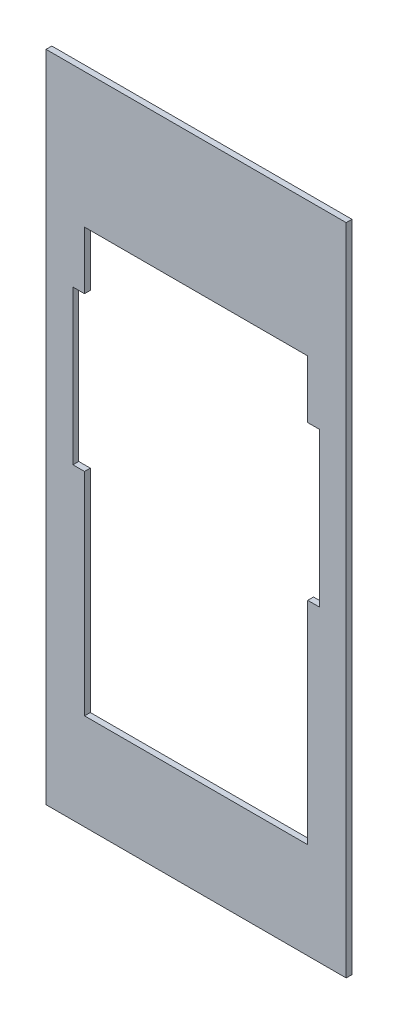
ISO-10303-21;
HEADER;
FILE_DESCRIPTION(('STEP AP214'),'2;1');
FILE_NAME('part.step','',(''),(''),'','','');
FILE_SCHEMA(('AUTOMOTIVE_DESIGN { 1 0 10303 214 1 1 1 1 }'));
ENDSEC;
DATA;
#1=APPLICATION_CONTEXT('core data for automotive mechanical design processes');
#2=APPLICATION_PROTOCOL_DEFINITION('international standard','automotive_design',2000,#1);
#3=PRODUCT_CONTEXT('',#1,'mechanical');
#4=PRODUCT('Part','Part','',(#3));
#5=PRODUCT_RELATED_PRODUCT_CATEGORY('part','',(#4));
#6=PRODUCT_DEFINITION_FORMATION('','',#4);
#7=PRODUCT_DEFINITION_CONTEXT('part definition',#1,'design');
#8=PRODUCT_DEFINITION('design','',#6,#7);
#9=PRODUCT_DEFINITION_SHAPE('','',#8);
#10=(LENGTH_UNIT() NAMED_UNIT(*) SI_UNIT(.MILLI.,.METRE.));
#11=(NAMED_UNIT(*) PLANE_ANGLE_UNIT() SI_UNIT($,.RADIAN.));
#12=(NAMED_UNIT(*) SI_UNIT($,.STERADIAN.) SOLID_ANGLE_UNIT());
#13=UNCERTAINTY_MEASURE_WITH_UNIT(LENGTH_MEASURE(1.E-05),#10,'distance_accuracy_value','');
#14=(GEOMETRIC_REPRESENTATION_CONTEXT(3) GLOBAL_UNCERTAINTY_ASSIGNED_CONTEXT((#13)) GLOBAL_UNIT_ASSIGNED_CONTEXT((#10,
#11,#12)) REPRESENTATION_CONTEXT('',''));
#15=CARTESIAN_POINT('',(0.,0.,0.));
#16=DIRECTION('',(0.,0.,1.));
#17=DIRECTION('',(1.,0.,0.));
#18=AXIS2_PLACEMENT_3D('',#15,#16,#17);
#19=CARTESIAN_POINT('',(0.,0.,1.5));
#20=DIRECTION('',(0.,0.,-1.));
#21=DIRECTION('',(-1.,0.,0.));
#22=AXIS2_PLACEMENT_3D('',#19,#20,#21);
#23=PLANE('',#22);
#24=DIRECTION('',(0.,-1.,0.));
#25=VECTOR('',#24,1.);
#26=CARTESIAN_POINT('',(-39.,84.9999999999999,1.5));
#27=LINE('',#26,#25);
#28=CARTESIAN_POINT('',(-39.,84.9999999999999,1.5));
#29=VERTEX_POINT('',#28);
#30=CARTESIAN_POINT('',(-39.,-85.0000000000001,1.5));
#31=VERTEX_POINT('',#30);
#32=EDGE_CURVE('E239',#29,#31,#27,.T.);
#33=ORIENTED_EDGE('',*,*,#32,.T.);
#34=DIRECTION('',(1.,0.,0.));
#35=VECTOR('',#34,1.);
#36=CARTESIAN_POINT('',(39.,-85.0000000000001,1.5));
#37=LINE('',#36,#35);
#38=CARTESIAN_POINT('',(39.,-85.0000000000001,1.5));
#39=VERTEX_POINT('',#38);
#40=EDGE_CURVE('E242',#31,#39,#37,.T.);
#41=ORIENTED_EDGE('',*,*,#40,.T.);
#42=DIRECTION('',(0.,1.,0.));
#43=VECTOR('',#42,1.);
#44=CARTESIAN_POINT('',(39.,85.,1.5));
#45=LINE('',#44,#43);
#46=CARTESIAN_POINT('',(39.,85.,1.5));
#47=VERTEX_POINT('',#46);
#48=EDGE_CURVE('E245',#39,#47,#45,.T.);
#49=ORIENTED_EDGE('',*,*,#48,.T.);
#50=DIRECTION('',(-1.,0.,0.));
#51=VECTOR('',#50,1.);
#52=CARTESIAN_POINT('',(39.,85.,1.5));
#53=LINE('',#52,#51);
#54=EDGE_CURVE('E247',#47,#29,#53,.T.);
#55=ORIENTED_EDGE('',*,*,#54,.T.);
#56=EDGE_LOOP('',(#33,#41,#49,#55));
#57=FACE_BOUND('',#56,.T.);
#58=DIRECTION('',(0.,-1.,0.));
#59=VECTOR('',#58,1.);
#60=CARTESIAN_POINT('',(-29.,-5.00000000000007,1.5));
#61=LINE('',#60,#59);
#62=CARTESIAN_POINT('',(-29.,-5.00000000000007,1.5));
#63=VERTEX_POINT('',#62);
#64=CARTESIAN_POINT('',(-29.,-60.0000000000001,1.5));
#65=VERTEX_POINT('',#64);
#66=EDGE_CURVE('E146',#63,#65,#61,.T.);
#67=ORIENTED_EDGE('',*,*,#66,.F.);
#68=DIRECTION('',(1.,0.,0.));
#69=VECTOR('',#68,1.);
#70=CARTESIAN_POINT('',(-29.,-5.00000000000007,1.5));
#71=LINE('',#70,#69);
#72=CARTESIAN_POINT('',(-32.,-5.00000000000007,1.5));
#73=VERTEX_POINT('',#72);
#74=EDGE_CURVE('E187',#73,#63,#71,.T.);
#75=ORIENTED_EDGE('',*,*,#74,.F.);
#76=DIRECTION('',(0.,-1.,0.));
#77=VECTOR('',#76,1.);
#78=CARTESIAN_POINT('',(-32.,34.9999999999999,1.5));
#79=LINE('',#78,#77);
#80=CARTESIAN_POINT('',(-32.,34.9999999999999,1.5));
#81=VERTEX_POINT('',#80);
#82=EDGE_CURVE('E185',#81,#73,#79,.T.);
#83=ORIENTED_EDGE('',*,*,#82,.F.);
#84=DIRECTION('',(-1.,0.,0.));
#85=VECTOR('',#84,1.);
#86=CARTESIAN_POINT('',(-29.,34.9999999999999,1.5));
#87=LINE('',#86,#85);
#88=CARTESIAN_POINT('',(-29.,34.9999999999999,1.5));
#89=VERTEX_POINT('',#88);
#90=EDGE_CURVE('E183',#89,#81,#87,.T.);
#91=ORIENTED_EDGE('',*,*,#90,.F.);
#92=DIRECTION('',(0.,-1.,0.));
#93=VECTOR('',#92,1.);
#94=CARTESIAN_POINT('',(-29.,49.9999999999999,1.5));
#95=LINE('',#94,#93);
#96=CARTESIAN_POINT('',(-29.,49.9999999999999,1.5));
#97=VERTEX_POINT('',#96);
#98=EDGE_CURVE('E181',#97,#89,#95,.T.);
#99=ORIENTED_EDGE('',*,*,#98,.F.);
#100=DIRECTION('',(-1.,0.,0.));
#101=VECTOR('',#100,1.);
#102=CARTESIAN_POINT('',(29.,49.9999999999999,1.5));
#103=LINE('',#102,#101);
#104=CARTESIAN_POINT('',(29.,49.9999999999999,1.5));
#105=VERTEX_POINT('',#104);
#106=EDGE_CURVE('E179',#105,#97,#103,.T.);
#107=ORIENTED_EDGE('',*,*,#106,.F.);
#108=DIRECTION('',(0.,1.,0.));
#109=VECTOR('',#108,1.);
#110=CARTESIAN_POINT('',(29.,49.9999999999999,1.5));
#111=LINE('',#110,#109);
#112=CARTESIAN_POINT('',(29.,34.9999999999999,1.5));
#113=VERTEX_POINT('',#112);
#114=EDGE_CURVE('E177',#113,#105,#111,.T.);
#115=ORIENTED_EDGE('',*,*,#114,.F.);
#116=DIRECTION('',(-1.,0.,0.));
#117=VECTOR('',#116,1.);
#118=CARTESIAN_POINT('',(29.,34.9999999999999,1.5));
#119=LINE('',#118,#117);
#120=CARTESIAN_POINT('',(32.,34.9999999999999,1.5));
#121=VERTEX_POINT('',#120);
#122=EDGE_CURVE('E175',#121,#113,#119,.T.);
#123=ORIENTED_EDGE('',*,*,#122,.F.);
#124=DIRECTION('',(0.,1.,0.));
#125=VECTOR('',#124,1.);
#126=CARTESIAN_POINT('',(32.,34.9999999999999,1.5));
#127=LINE('',#126,#125);
#128=CARTESIAN_POINT('',(32.,-5.00000000000007,1.5));
#129=VERTEX_POINT('',#128);
#130=EDGE_CURVE('E173',#129,#121,#127,.T.);
#131=ORIENTED_EDGE('',*,*,#130,.F.);
#132=DIRECTION('',(1.,0.,0.));
#133=VECTOR('',#132,1.);
#134=CARTESIAN_POINT('',(29.,-5.00000000000007,1.5));
#135=LINE('',#134,#133);
#136=CARTESIAN_POINT('',(29.,-5.00000000000007,1.5));
#137=VERTEX_POINT('',#136);
#138=EDGE_CURVE('E169',#137,#129,#135,.T.);
#139=ORIENTED_EDGE('',*,*,#138,.F.);
#140=DIRECTION('',(0.,1.,0.));
#141=VECTOR('',#140,1.);
#142=CARTESIAN_POINT('',(29.,-5.00000000000007,1.5));
#143=LINE('',#142,#141);
#144=CARTESIAN_POINT('',(29.,-60.0000000000001,1.5));
#145=VERTEX_POINT('',#144);
#146=EDGE_CURVE('E167',#145,#137,#143,.T.);
#147=ORIENTED_EDGE('',*,*,#146,.F.);
#148=DIRECTION('',(1.,0.,0.));
#149=VECTOR('',#148,1.);
#150=CARTESIAN_POINT('',(-29.,-60.0000000000001,1.5));
#151=LINE('',#150,#149);
#152=EDGE_CURVE('E154',#65,#145,#151,.T.);
#153=ORIENTED_EDGE('',*,*,#152,.F.);
#154=EDGE_LOOP('',(#67,#75,#83,#91,#99,#107,#115,#123,#131,#139,#147,#153));
#155=FACE_BOUND('',#154,.T.);
#156=ADVANCED_FACE('F33',(#57,#155),#23,.F.);
#157=CARTESIAN_POINT('',(0.,0.,0.));
#158=DIRECTION('',(0.,0.,-1.));
#159=DIRECTION('',(-1.,0.,0.));
#160=AXIS2_PLACEMENT_3D('',#157,#158,#159);
#161=PLANE('',#160);
#162=DIRECTION('',(0.,-1.,0.));
#163=VECTOR('',#162,1.);
#164=CARTESIAN_POINT('',(-39.,84.9999999999999,0.));
#165=LINE('',#164,#163);
#166=CARTESIAN_POINT('',(-39.,84.9999999999999,0.));
#167=VERTEX_POINT('',#166);
#168=CARTESIAN_POINT('',(-39.,-85.0000000000001,0.));
#169=VERTEX_POINT('',#168);
#170=EDGE_CURVE('E162',#167,#169,#165,.T.);
#171=ORIENTED_EDGE('',*,*,#170,.F.);
#172=DIRECTION('',(-1.,0.,0.));
#173=VECTOR('',#172,1.);
#174=CARTESIAN_POINT('',(39.,85.,0.));
#175=LINE('',#174,#173);
#176=CARTESIAN_POINT('',(39.,85.,0.));
#177=VERTEX_POINT('',#176);
#178=EDGE_CURVE('E243',#177,#167,#175,.T.);
#179=ORIENTED_EDGE('',*,*,#178,.F.);
#180=DIRECTION('',(0.,1.,0.));
#181=VECTOR('',#180,1.);
#182=CARTESIAN_POINT('',(39.,85.,0.));
#183=LINE('',#182,#181);
#184=CARTESIAN_POINT('',(39.,-85.0000000000001,0.));
#185=VERTEX_POINT('',#184);
#186=EDGE_CURVE('E254',#185,#177,#183,.T.);
#187=ORIENTED_EDGE('',*,*,#186,.F.);
#188=DIRECTION('',(1.,0.,0.));
#189=VECTOR('',#188,1.);
#190=CARTESIAN_POINT('',(39.,-85.0000000000001,0.));
#191=LINE('',#190,#189);
#192=EDGE_CURVE('E252',#169,#185,#191,.T.);
#193=ORIENTED_EDGE('',*,*,#192,.F.);
#194=EDGE_LOOP('',(#171,#179,#187,#193));
#195=FACE_BOUND('',#194,.T.);
#196=DIRECTION('',(1.,0.,0.));
#197=VECTOR('',#196,1.);
#198=CARTESIAN_POINT('',(-29.,-5.00000000000007,0.));
#199=LINE('',#198,#197);
#200=CARTESIAN_POINT('',(-32.,-5.00000000000007,0.));
#201=VERTEX_POINT('',#200);
#202=CARTESIAN_POINT('',(-29.,-5.00000000000007,0.));
#203=VERTEX_POINT('',#202);
#204=EDGE_CURVE('E155',#201,#203,#199,.T.);
#205=ORIENTED_EDGE('',*,*,#204,.T.);
#206=DIRECTION('',(0.,-1.,0.));
#207=VECTOR('',#206,1.);
#208=CARTESIAN_POINT('',(-29.,-5.00000000000007,0.));
#209=LINE('',#208,#207);
#210=CARTESIAN_POINT('',(-29.,-60.0000000000001,0.));
#211=VERTEX_POINT('',#210);
#212=EDGE_CURVE('E56',#203,#211,#209,.T.);
#213=ORIENTED_EDGE('',*,*,#212,.T.);
#214=DIRECTION('',(1.,0.,0.));
#215=VECTOR('',#214,1.);
#216=CARTESIAN_POINT('',(-29.,-60.0000000000001,0.));
#217=LINE('',#216,#215);
#218=CARTESIAN_POINT('',(29.,-60.0000000000001,0.));
#219=VERTEX_POINT('',#218);
#220=EDGE_CURVE('E161',#211,#219,#217,.T.);
#221=ORIENTED_EDGE('',*,*,#220,.T.);
#222=DIRECTION('',(0.,1.,0.));
#223=VECTOR('',#222,1.);
#224=CARTESIAN_POINT('',(29.,-5.00000000000007,0.));
#225=LINE('',#224,#223);
#226=CARTESIAN_POINT('',(29.,-5.00000000000007,0.));
#227=VERTEX_POINT('',#226);
#228=EDGE_CURVE('E191',#219,#227,#225,.T.);
#229=ORIENTED_EDGE('',*,*,#228,.T.);
#230=DIRECTION('',(1.,0.,0.));
#231=VECTOR('',#230,1.);
#232=CARTESIAN_POINT('',(29.,-5.00000000000007,0.));
#233=LINE('',#232,#231);
#234=CARTESIAN_POINT('',(32.,-5.00000000000007,0.));
#235=VERTEX_POINT('',#234);
#236=EDGE_CURVE('E194',#227,#235,#233,.T.);
#237=ORIENTED_EDGE('',*,*,#236,.T.);
#238=DIRECTION('',(0.,1.,0.));
#239=VECTOR('',#238,1.);
#240=CARTESIAN_POINT('',(32.,34.9999999999999,0.));
#241=LINE('',#240,#239);
#242=CARTESIAN_POINT('',(32.,34.9999999999999,0.));
#243=VERTEX_POINT('',#242);
#244=EDGE_CURVE('E197',#235,#243,#241,.T.);
#245=ORIENTED_EDGE('',*,*,#244,.T.);
#246=DIRECTION('',(-1.,0.,0.));
#247=VECTOR('',#246,1.);
#248=CARTESIAN_POINT('',(29.,34.9999999999999,0.));
#249=LINE('',#248,#247);
#250=CARTESIAN_POINT('',(29.,34.9999999999999,0.));
#251=VERTEX_POINT('',#250);
#252=EDGE_CURVE('E200',#243,#251,#249,.T.);
#253=ORIENTED_EDGE('',*,*,#252,.T.);
#254=DIRECTION('',(0.,1.,0.));
#255=VECTOR('',#254,1.);
#256=CARTESIAN_POINT('',(29.,49.9999999999999,0.));
#257=LINE('',#256,#255);
#258=CARTESIAN_POINT('',(29.,49.9999999999999,0.));
#259=VERTEX_POINT('',#258);
#260=EDGE_CURVE('E203',#251,#259,#257,.T.);
#261=ORIENTED_EDGE('',*,*,#260,.T.);
#262=DIRECTION('',(-1.,0.,0.));
#263=VECTOR('',#262,1.);
#264=CARTESIAN_POINT('',(29.,49.9999999999999,0.));
#265=LINE('',#264,#263);
#266=CARTESIAN_POINT('',(-29.,49.9999999999999,0.));
#267=VERTEX_POINT('',#266);
#268=EDGE_CURVE('E206',#259,#267,#265,.T.);
#269=ORIENTED_EDGE('',*,*,#268,.T.);
#270=DIRECTION('',(0.,-1.,0.));
#271=VECTOR('',#270,1.);
#272=CARTESIAN_POINT('',(-29.,49.9999999999999,0.));
#273=LINE('',#272,#271);
#274=CARTESIAN_POINT('',(-29.,34.9999999999999,0.));
#275=VERTEX_POINT('',#274);
#276=EDGE_CURVE('E209',#267,#275,#273,.T.);
#277=ORIENTED_EDGE('',*,*,#276,.T.);
#278=DIRECTION('',(-1.,0.,0.));
#279=VECTOR('',#278,1.);
#280=CARTESIAN_POINT('',(-29.,34.9999999999999,0.));
#281=LINE('',#280,#279);
#282=CARTESIAN_POINT('',(-32.,34.9999999999999,0.));
#283=VERTEX_POINT('',#282);
#284=EDGE_CURVE('E212',#275,#283,#281,.T.);
#285=ORIENTED_EDGE('',*,*,#284,.T.);
#286=DIRECTION('',(0.,-1.,0.));
#287=VECTOR('',#286,1.);
#288=CARTESIAN_POINT('',(-32.,34.9999999999999,0.));
#289=LINE('',#288,#287);
#290=EDGE_CURVE('E215',#283,#201,#289,.T.);
#291=ORIENTED_EDGE('',*,*,#290,.T.);
#292=EDGE_LOOP('',(#205,#213,#221,#229,#237,#245,#253,#261,#269,#277,#285,#291));
#293=FACE_BOUND('',#292,.T.);
#294=ADVANCED_FACE('F272',(#195,#293),#161,.T.);
#295=CARTESIAN_POINT('',(-39.,84.9999999999999,1.5));
#296=DIRECTION('',(1.,0.,0.));
#297=DIRECTION('',(0.,1.,0.));
#298=AXIS2_PLACEMENT_3D('',#295,#296,#297);
#299=PLANE('',#298);
#300=ORIENTED_EDGE('',*,*,#170,.T.);
#301=DIRECTION('',(0.,0.,-1.));
#302=VECTOR('',#301,1.);
#303=CARTESIAN_POINT('',(-39.,-85.0000000000001,1.5));
#304=LINE('',#303,#302);
#305=EDGE_CURVE('E11',#31,#169,#304,.T.);
#306=ORIENTED_EDGE('',*,*,#305,.F.);
#307=ORIENTED_EDGE('',*,*,#32,.F.);
#308=DIRECTION('',(0.,0.,-1.));
#309=VECTOR('',#308,1.);
#310=CARTESIAN_POINT('',(-39.,84.9999999999999,1.5));
#311=LINE('',#310,#309);
#312=EDGE_CURVE('E249',#29,#167,#311,.T.);
#313=ORIENTED_EDGE('',*,*,#312,.T.);
#314=EDGE_LOOP('',(#300,#306,#307,#313));
#315=FACE_BOUND('',#314,.T.);
#316=ADVANCED_FACE('F35',(#315),#299,.F.);
#317=CARTESIAN_POINT('',(39.,-85.0000000000001,1.5));
#318=DIRECTION('',(0.,1.,0.));
#319=DIRECTION('',(-1.,0.,0.));
#320=AXIS2_PLACEMENT_3D('',#317,#318,#319);
#321=PLANE('',#320);
#322=ORIENTED_EDGE('',*,*,#192,.T.);
#323=DIRECTION('',(0.,0.,-1.));
#324=VECTOR('',#323,1.);
#325=CARTESIAN_POINT('',(39.,-85.0000000000001,1.5));
#326=LINE('',#325,#324);
#327=EDGE_CURVE('E41',#39,#185,#326,.T.);
#328=ORIENTED_EDGE('',*,*,#327,.F.);
#329=ORIENTED_EDGE('',*,*,#40,.F.);
#330=ORIENTED_EDGE('',*,*,#305,.T.);
#331=EDGE_LOOP('',(#322,#328,#329,#330));
#332=FACE_BOUND('',#331,.T.);
#333=ADVANCED_FACE('F282',(#332),#321,.F.);
#334=CARTESIAN_POINT('',(39.,85.,1.5));
#335=DIRECTION('',(-1.,0.,0.));
#336=DIRECTION('',(0.,-1.,0.));
#337=AXIS2_PLACEMENT_3D('',#334,#335,#336);
#338=PLANE('',#337);
#339=ORIENTED_EDGE('',*,*,#186,.T.);
#340=DIRECTION('',(0.,0.,-1.));
#341=VECTOR('',#340,1.);
#342=CARTESIAN_POINT('',(39.,85.,1.5));
#343=LINE('',#342,#341);
#344=EDGE_CURVE('E259',#47,#177,#343,.T.);
#345=ORIENTED_EDGE('',*,*,#344,.F.);
#346=ORIENTED_EDGE('',*,*,#48,.F.);
#347=ORIENTED_EDGE('',*,*,#327,.T.);
#348=EDGE_LOOP('',(#339,#345,#346,#347));
#349=FACE_BOUND('',#348,.T.);
#350=ADVANCED_FACE('F266',(#349),#338,.F.);
#351=CARTESIAN_POINT('',(39.,85.,1.5));
#352=DIRECTION('',(0.,-1.,0.));
#353=DIRECTION('',(1.,0.,0.));
#354=AXIS2_PLACEMENT_3D('',#351,#352,#353);
#355=PLANE('',#354);
#356=ORIENTED_EDGE('',*,*,#178,.T.);
#357=ORIENTED_EDGE('',*,*,#312,.F.);
#358=ORIENTED_EDGE('',*,*,#54,.F.);
#359=ORIENTED_EDGE('',*,*,#344,.T.);
#360=EDGE_LOOP('',(#356,#357,#358,#359));
#361=FACE_BOUND('',#360,.T.);
#362=ADVANCED_FACE('F276',(#361),#355,.F.);
#363=CARTESIAN_POINT('',(-29.,-5.00000000000007,1.5));
#364=DIRECTION('',(1.,0.,0.));
#365=DIRECTION('',(0.,1.,0.));
#366=AXIS2_PLACEMENT_3D('',#363,#364,#365);
#367=PLANE('',#366);
#368=ORIENTED_EDGE('',*,*,#212,.F.);
#369=DIRECTION('',(0.,0.,-1.));
#370=VECTOR('',#369,1.);
#371=CARTESIAN_POINT('',(-29.,-5.00000000000007,1.5));
#372=LINE('',#371,#370);
#373=EDGE_CURVE('E150',#63,#203,#372,.T.);
#374=ORIENTED_EDGE('',*,*,#373,.F.);
#375=ORIENTED_EDGE('',*,*,#66,.T.);
#376=DIRECTION('',(0.,0.,-1.));
#377=VECTOR('',#376,1.);
#378=CARTESIAN_POINT('',(-29.,-60.0000000000001,1.5));
#379=LINE('',#378,#377);
#380=EDGE_CURVE('E149',#65,#211,#379,.T.);
#381=ORIENTED_EDGE('',*,*,#380,.T.);
#382=EDGE_LOOP('',(#368,#374,#375,#381));
#383=FACE_BOUND('',#382,.T.);
#384=ADVANCED_FACE('F148',(#383),#367,.T.);
#385=CARTESIAN_POINT('',(-29.,-60.0000000000001,1.5));
#386=DIRECTION('',(0.,1.,0.));
#387=DIRECTION('',(0.,0.,1.));
#388=AXIS2_PLACEMENT_3D('',#385,#386,#387);
#389=PLANE('',#388);
#390=ORIENTED_EDGE('',*,*,#220,.F.);
#391=ORIENTED_EDGE('',*,*,#380,.F.);
#392=ORIENTED_EDGE('',*,*,#152,.T.);
#393=DIRECTION('',(0.,0.,-1.));
#394=VECTOR('',#393,1.);
#395=CARTESIAN_POINT('',(29.,-60.0000000000001,1.5));
#396=LINE('',#395,#394);
#397=EDGE_CURVE('E163',#145,#219,#396,.T.);
#398=ORIENTED_EDGE('',*,*,#397,.T.);
#399=EDGE_LOOP('',(#390,#391,#392,#398));
#400=FACE_BOUND('',#399,.T.);
#401=ADVANCED_FACE('F158',(#400),#389,.T.);
#402=CARTESIAN_POINT('',(29.,-5.00000000000007,1.5));
#403=DIRECTION('',(-1.,0.,0.));
#404=DIRECTION('',(0.,-1.,0.));
#405=AXIS2_PLACEMENT_3D('',#402,#403,#404);
#406=PLANE('',#405);
#407=ORIENTED_EDGE('',*,*,#228,.F.);
#408=ORIENTED_EDGE('',*,*,#397,.F.);
#409=ORIENTED_EDGE('',*,*,#146,.T.);
#410=DIRECTION('',(0.,0.,-1.));
#411=VECTOR('',#410,1.);
#412=CARTESIAN_POINT('',(29.,-5.00000000000007,1.5));
#413=LINE('',#412,#411);
#414=EDGE_CURVE('E236',#137,#227,#413,.T.);
#415=ORIENTED_EDGE('',*,*,#414,.T.);
#416=EDGE_LOOP('',(#407,#408,#409,#415));
#417=FACE_BOUND('',#416,.T.);
#418=ADVANCED_FACE('F305',(#417),#406,.T.);
#419=CARTESIAN_POINT('',(29.,-5.00000000000007,1.5));
#420=DIRECTION('',(0.,1.,0.));
#421=DIRECTION('',(-1.,0.,0.));
#422=AXIS2_PLACEMENT_3D('',#419,#420,#421);
#423=PLANE('',#422);
#424=ORIENTED_EDGE('',*,*,#236,.F.);
#425=ORIENTED_EDGE('',*,*,#414,.F.);
#426=ORIENTED_EDGE('',*,*,#138,.T.);
#427=DIRECTION('',(0.,0.,-1.));
#428=VECTOR('',#427,1.);
#429=CARTESIAN_POINT('',(32.,-5.00000000000007,1.5));
#430=LINE('',#429,#428);
#431=EDGE_CURVE('E234',#129,#235,#430,.T.);
#432=ORIENTED_EDGE('',*,*,#431,.T.);
#433=EDGE_LOOP('',(#424,#425,#426,#432));
#434=FACE_BOUND('',#433,.T.);
#435=ADVANCED_FACE('F309',(#434),#423,.T.);
#436=CARTESIAN_POINT('',(32.,34.9999999999999,1.5));
#437=DIRECTION('',(-1.,0.,0.));
#438=DIRECTION('',(0.,0.,1.));
#439=AXIS2_PLACEMENT_3D('',#436,#437,#438);
#440=PLANE('',#439);
#441=ORIENTED_EDGE('',*,*,#244,.F.);
#442=ORIENTED_EDGE('',*,*,#431,.F.);
#443=ORIENTED_EDGE('',*,*,#130,.T.);
#444=DIRECTION('',(0.,0.,-1.));
#445=VECTOR('',#444,1.);
#446=CARTESIAN_POINT('',(32.,34.9999999999999,1.5));
#447=LINE('',#446,#445);
#448=EDGE_CURVE('E232',#121,#243,#447,.T.);
#449=ORIENTED_EDGE('',*,*,#448,.T.);
#450=EDGE_LOOP('',(#441,#442,#443,#449));
#451=FACE_BOUND('',#450,.T.);
#452=ADVANCED_FACE('F315',(#451),#440,.T.);
#453=CARTESIAN_POINT('',(29.,34.9999999999999,1.5));
#454=DIRECTION('',(0.,-1.,0.));
#455=DIRECTION('',(0.,0.,-1.));
#456=AXIS2_PLACEMENT_3D('',#453,#454,#455);
#457=PLANE('',#456);
#458=ORIENTED_EDGE('',*,*,#252,.F.);
#459=ORIENTED_EDGE('',*,*,#448,.F.);
#460=ORIENTED_EDGE('',*,*,#122,.T.);
#461=DIRECTION('',(0.,0.,-1.));
#462=VECTOR('',#461,1.);
#463=CARTESIAN_POINT('',(29.,34.9999999999999,1.5));
#464=LINE('',#463,#462);
#465=EDGE_CURVE('E230',#113,#251,#464,.T.);
#466=ORIENTED_EDGE('',*,*,#465,.T.);
#467=EDGE_LOOP('',(#458,#459,#460,#466));
#468=FACE_BOUND('',#467,.T.);
#469=ADVANCED_FACE('F319',(#468),#457,.T.);
#470=CARTESIAN_POINT('',(29.,49.9999999999999,1.5));
#471=DIRECTION('',(-1.,0.,0.));
#472=DIRECTION('',(0.,-1.,0.));
#473=AXIS2_PLACEMENT_3D('',#470,#471,#472);
#474=PLANE('',#473);
#475=ORIENTED_EDGE('',*,*,#260,.F.);
#476=ORIENTED_EDGE('',*,*,#465,.F.);
#477=ORIENTED_EDGE('',*,*,#114,.T.);
#478=DIRECTION('',(0.,0.,-1.));
#479=VECTOR('',#478,1.);
#480=CARTESIAN_POINT('',(29.,49.9999999999999,1.5));
#481=LINE('',#480,#479);
#482=EDGE_CURVE('E228',#105,#259,#481,.T.);
#483=ORIENTED_EDGE('',*,*,#482,.T.);
#484=EDGE_LOOP('',(#475,#476,#477,#483));
#485=FACE_BOUND('',#484,.T.);
#486=ADVANCED_FACE('F323',(#485),#474,.T.);
#487=CARTESIAN_POINT('',(29.,49.9999999999999,1.5));
#488=DIRECTION('',(0.,-1.,0.));
#489=DIRECTION('',(0.,0.,-1.));
#490=AXIS2_PLACEMENT_3D('',#487,#488,#489);
#491=PLANE('',#490);
#492=ORIENTED_EDGE('',*,*,#268,.F.);
#493=ORIENTED_EDGE('',*,*,#482,.F.);
#494=ORIENTED_EDGE('',*,*,#106,.T.);
#495=DIRECTION('',(0.,0.,-1.));
#496=VECTOR('',#495,1.);
#497=CARTESIAN_POINT('',(-29.,49.9999999999999,1.5));
#498=LINE('',#497,#496);
#499=EDGE_CURVE('E226',#97,#267,#498,.T.);
#500=ORIENTED_EDGE('',*,*,#499,.T.);
#501=EDGE_LOOP('',(#492,#493,#494,#500));
#502=FACE_BOUND('',#501,.T.);
#503=ADVANCED_FACE('F327',(#502),#491,.T.);
#504=CARTESIAN_POINT('',(-29.,49.9999999999999,1.5));
#505=DIRECTION('',(1.,0.,0.));
#506=DIRECTION('',(0.,1.,0.));
#507=AXIS2_PLACEMENT_3D('',#504,#505,#506);
#508=PLANE('',#507);
#509=ORIENTED_EDGE('',*,*,#276,.F.);
#510=ORIENTED_EDGE('',*,*,#499,.F.);
#511=ORIENTED_EDGE('',*,*,#98,.T.);
#512=DIRECTION('',(0.,0.,-1.));
#513=VECTOR('',#512,1.);
#514=CARTESIAN_POINT('',(-29.,34.9999999999999,1.5));
#515=LINE('',#514,#513);
#516=EDGE_CURVE('E224',#89,#275,#515,.T.);
#517=ORIENTED_EDGE('',*,*,#516,.T.);
#518=EDGE_LOOP('',(#509,#510,#511,#517));
#519=FACE_BOUND('',#518,.T.);
#520=ADVANCED_FACE('F331',(#519),#508,.T.);
#521=CARTESIAN_POINT('',(-29.,34.9999999999999,1.5));
#522=DIRECTION('',(0.,-1.,0.));
#523=DIRECTION('',(0.,0.,-1.));
#524=AXIS2_PLACEMENT_3D('',#521,#522,#523);
#525=PLANE('',#524);
#526=ORIENTED_EDGE('',*,*,#284,.F.);
#527=ORIENTED_EDGE('',*,*,#516,.F.);
#528=ORIENTED_EDGE('',*,*,#90,.T.);
#529=DIRECTION('',(0.,0.,-1.));
#530=VECTOR('',#529,1.);
#531=CARTESIAN_POINT('',(-32.,34.9999999999999,1.5));
#532=LINE('',#531,#530);
#533=EDGE_CURVE('E222',#81,#283,#532,.T.);
#534=ORIENTED_EDGE('',*,*,#533,.T.);
#535=EDGE_LOOP('',(#526,#527,#528,#534));
#536=FACE_BOUND('',#535,.T.);
#537=ADVANCED_FACE('F335',(#536),#525,.T.);
#538=CARTESIAN_POINT('',(-32.,34.9999999999999,1.5));
#539=DIRECTION('',(1.,0.,0.));
#540=DIRECTION('',(0.,0.,-1.));
#541=AXIS2_PLACEMENT_3D('',#538,#539,#540);
#542=PLANE('',#541);
#543=ORIENTED_EDGE('',*,*,#290,.F.);
#544=ORIENTED_EDGE('',*,*,#533,.F.);
#545=ORIENTED_EDGE('',*,*,#82,.T.);
#546=DIRECTION('',(0.,0.,-1.));
#547=VECTOR('',#546,1.);
#548=CARTESIAN_POINT('',(-32.,-5.00000000000007,1.5));
#549=LINE('',#548,#547);
#550=EDGE_CURVE('E48',#73,#201,#549,.T.);
#551=ORIENTED_EDGE('',*,*,#550,.T.);
#552=EDGE_LOOP('',(#543,#544,#545,#551));
#553=FACE_BOUND('',#552,.T.);
#554=ADVANCED_FACE('F339',(#553),#542,.T.);
#555=CARTESIAN_POINT('',(-29.,-5.00000000000007,1.5));
#556=DIRECTION('',(0.,1.,0.));
#557=DIRECTION('',(-1.,0.,0.));
#558=AXIS2_PLACEMENT_3D('',#555,#556,#557);
#559=PLANE('',#558);
#560=ORIENTED_EDGE('',*,*,#204,.F.);
#561=ORIENTED_EDGE('',*,*,#550,.F.);
#562=ORIENTED_EDGE('',*,*,#74,.T.);
#563=ORIENTED_EDGE('',*,*,#373,.T.);
#564=EDGE_LOOP('',(#560,#561,#562,#563));
#565=FACE_BOUND('',#564,.T.);
#566=ADVANCED_FACE('F343',(#565),#559,.T.);
#567=CLOSED_SHELL('',(#156,#294,#316,#333,#350,#362,#384,#401,#418,#435,#452,#469,#486,#503,
#520,#537,#554,#566));
#568=MANIFOLD_SOLID_BREP('B2',#567);
#569=ADVANCED_BREP_SHAPE_REPRESENTATION('',(#18,#568),#14);
#570=SHAPE_DEFINITION_REPRESENTATION(#9,#569);
ENDSEC;
END-ISO-10303-21;
